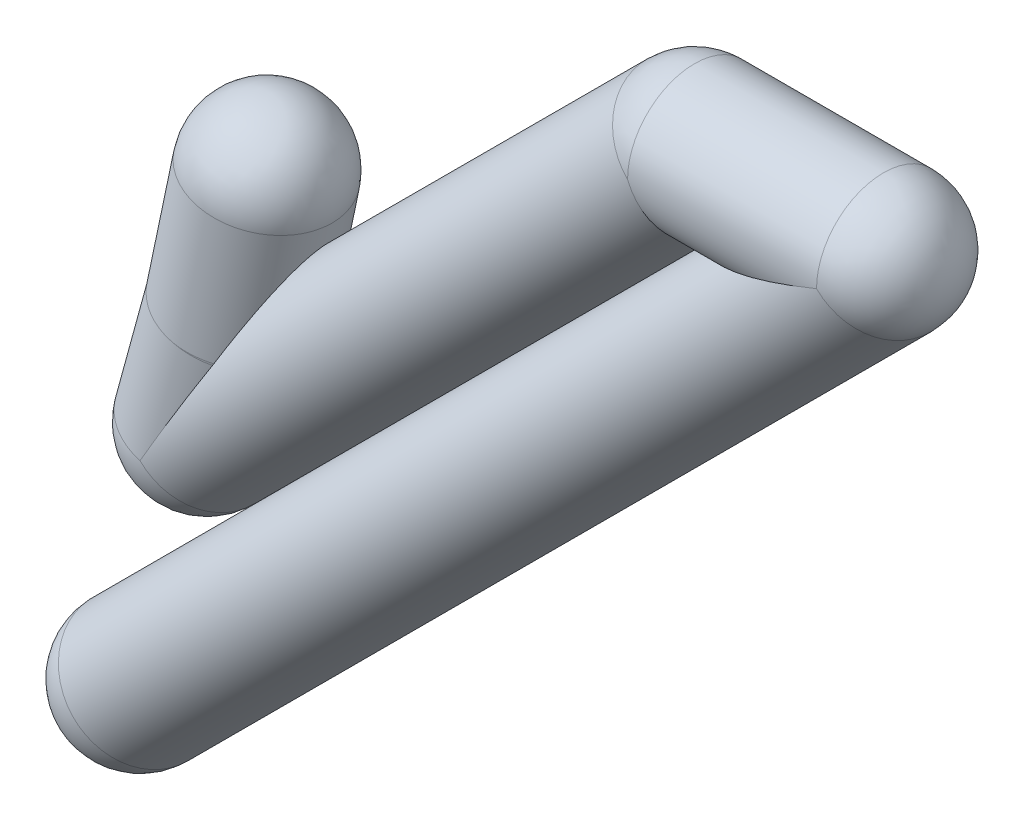
ISO-10303-21;
HEADER;
FILE_DESCRIPTION(('STEP AP214'),'2;1');
FILE_NAME('part.step','',(''),(''),'','','');
FILE_SCHEMA(('AUTOMOTIVE_DESIGN { 1 0 10303 214 1 1 1 1 }'));
ENDSEC;
DATA;
#1=APPLICATION_CONTEXT('core data for automotive mechanical design processes');
#2=APPLICATION_PROTOCOL_DEFINITION('international standard','automotive_design',2000,#1);
#3=PRODUCT_CONTEXT('',#1,'mechanical');
#4=PRODUCT('Part','Part','',(#3));
#5=PRODUCT_RELATED_PRODUCT_CATEGORY('part','',(#4));
#6=PRODUCT_DEFINITION_FORMATION('','',#4);
#7=PRODUCT_DEFINITION_CONTEXT('part definition',#1,'design');
#8=PRODUCT_DEFINITION('design','',#6,#7);
#9=PRODUCT_DEFINITION_SHAPE('','',#8);
#10=(LENGTH_UNIT() NAMED_UNIT(*) SI_UNIT(.MILLI.,.METRE.));
#11=(NAMED_UNIT(*) PLANE_ANGLE_UNIT() SI_UNIT($,.RADIAN.));
#12=(NAMED_UNIT(*) SI_UNIT($,.STERADIAN.) SOLID_ANGLE_UNIT());
#13=UNCERTAINTY_MEASURE_WITH_UNIT(LENGTH_MEASURE(1.E-05),#10,'distance_accuracy_value','');
#14=(GEOMETRIC_REPRESENTATION_CONTEXT(3) GLOBAL_UNCERTAINTY_ASSIGNED_CONTEXT((#13)) GLOBAL_UNIT_ASSIGNED_CONTEXT((#10,
#11,#12)) REPRESENTATION_CONTEXT('',''));
#15=CARTESIAN_POINT('',(0.,0.,0.));
#16=DIRECTION('',(0.,0.,1.));
#17=DIRECTION('',(1.,0.,0.));
#18=AXIS2_PLACEMENT_3D('',#15,#16,#17);
#19=CARTESIAN_POINT('',(12.435,-1.174,2.325));
#20=DIRECTION('',(1.,0.,0.));
#21=DIRECTION('',(0.,-1.,0.));
#22=AXIS2_PLACEMENT_3D('',#19,#20,#21);
#23=SPHERICAL_SURFACE('',#22,0.24);
#24=CARTESIAN_POINT('',(12.435,-1.174,2.325));
#25=DIRECTION('',(-0.707106781186548,-0.707106781186547,0.));
#26=DIRECTION('',(0.707106781186547,-0.707106781186548,0.));
#27=AXIS2_PLACEMENT_3D('',#24,#25,#26);
#28=SPHERICAL_SURFACE('',#27,0.24);
#29=CARTESIAN_POINT('',(12.435,-1.174,2.325));
#30=DIRECTION('',(-0.707106781186548,-0.707106781186547,0.));
#31=DIRECTION('',(0.707106781186547,-0.707106781186548,0.));
#32=AXIS2_PLACEMENT_3D('',#29,#30,#31);
#33=CIRCLE('',#32,0.24);
#34=CARTESIAN_POINT('',(12.6047056274848,-1.34370562748477,2.325));
#35=VERTEX_POINT('',#34);
#36=EDGE_CURVE('E241',#35,#35,#33,.F.);
#37=ORIENTED_EDGE('',*,*,#36,.F.);
#38=EDGE_LOOP('',(#37));
#39=FACE_BOUND('',#38,.T.);
#40=ADVANCED_FACE('F63',(#39),#28,.T.);
#41=CARTESIAN_POINT('',(15.101,1.492,2.325));
#42=DIRECTION('',(-0.707106781186548,-0.707106781186547,0.));
#43=DIRECTION('',(0.707106781186547,-0.707106781186548,0.));
#44=AXIS2_PLACEMENT_3D('',#41,#42,#43);
#45=CYLINDRICAL_SURFACE('',#44,0.24);
#46=CARTESIAN_POINT('',(15.101,1.492,2.325));
#47=DIRECTION('',(0.38268343236509,-0.923879532511287,0.));
#48=DIRECTION('',(-0.923879532511287,-0.38268343236509,0.));
#49=AXIS2_PLACEMENT_3D('',#46,#47,#48);
#50=ELLIPSE('',#49,0.627150223140661,0.24);
#51=CARTESIAN_POINT('',(15.101,1.492,2.085));
#52=VERTEX_POINT('',#51);
#53=CARTESIAN_POINT('',(14.5222565276299,1.2522766046094,2.31348072466869));
#54=VERTEX_POINT('',#53);
#55=EDGE_CURVE('E12',#52,#54,#50,.F.);
#56=ORIENTED_EDGE('',*,*,#55,.F.);
#57=CARTESIAN_POINT('',(15.101,1.492,2.325));
#58=DIRECTION('',(-0.707106781186548,-0.707106781186547,0.));
#59=DIRECTION('',(0.707106781186547,-0.707106781186548,0.));
#60=AXIS2_PLACEMENT_3D('',#57,#58,#59);
#61=CIRCLE('',#60,0.24);
#62=CARTESIAN_POINT('',(15.101,1.492,2.565));
#63=VERTEX_POINT('',#62);
#64=EDGE_CURVE('E83',#52,#63,#61,.T.);
#65=ORIENTED_EDGE('',*,*,#64,.T.);
#66=CARTESIAN_POINT('',(14.5222565276299,1.2522766046094,2.3365192756046));
#67=VERTEX_POINT('',#66);
#68=EDGE_CURVE('E66',#67,#63,#50,.F.);
#69=ORIENTED_EDGE('',*,*,#68,.F.);
#70=CARTESIAN_POINT('',(14.9315484770248,1.66145152297523,2.31187130155912));
#71=CARTESIAN_POINT('',(14.8183932611086,1.54832866391458,2.31220720513702));
#72=CARTESIAN_POINT('',(14.7052411960202,1.43520895318279,2.3126706603257));
#73=CARTESIAN_POINT('',(14.3657767120083,1.09584153169066,2.31423044289002));
#74=CARTESIAN_POINT('',(14.1394668168106,0.869596341014294,2.31549615916292));
#75=CARTESIAN_POINT('',(13.6868372918324,0.417096230071525,2.31734150102584));
#76=CARTESIAN_POINT('',(13.4605176647894,0.190841312541712,2.31792118873812));
#77=CARTESIAN_POINT('',(13.2201221281214,-0.0494854905740796,2.32247921939916));
#78=CARTESIAN_POINT('',(13.2059808662314,-0.0636227092164164,2.32276184463907));
#79=CARTESIAN_POINT('',(13.184762909386,-0.0848345994555943,2.32324907258476));
#80=CARTESIAN_POINT('',(13.1776892321352,-0.0919062542110759,2.32342203066108));
#81=CARTESIAN_POINT('',(13.1670915424444,-0.102500913826222,2.32389016131879));
#82=CARTESIAN_POINT('',(13.1635610878239,-0.106030359024401,2.32408098956499));
#83=CARTESIAN_POINT('',(13.1582518429061,-0.111338085930861,2.3243235117166));
#84=CARTESIAN_POINT('',(13.1564796174392,-0.113109804685761,2.32439707202605));
#85=CARTESIAN_POINT('',(13.1546193698713,-0.114969520374432,2.32477761588291));
#86=CARTESIAN_POINT('',(13.1545100209914,-0.115078837989458,2.32480111392552));
#87=CARTESIAN_POINT('',(13.1543474957414,-0.115241316770415,2.3248477223718));
#88=CARTESIAN_POINT('',(13.1542935589342,-0.115295238156102,2.3248651570408));
#89=CARTESIAN_POINT('',(13.1542140686741,-0.115374705688486,2.32489953465524));
#90=CARTESIAN_POINT('',(13.1541877927299,-0.115400974119897,2.32491237475772));
#91=CARTESIAN_POINT('',(13.1541565863955,-0.115432171531798,2.32493366726682));
#92=CARTESIAN_POINT('',(13.1541503964615,-0.115438359695989,2.324938213098));
#93=CARTESIAN_POINT('',(13.1541384847982,-0.115450267953515,2.32494844025701));
#94=CARTESIAN_POINT('',(13.1541327621989,-0.115455988916624,2.32495411940378));
#95=CARTESIAN_POINT('',(13.1541252858451,-0.115463463132872,2.3249632837121));
#96=CARTESIAN_POINT('',(13.1541231497533,-0.115465598613896,2.32496613997214));
#97=CARTESIAN_POINT('',(13.1541192192782,-0.115469527965226,2.32497228743375));
#98=CARTESIAN_POINT('',(13.1541174229896,-0.115471323740196,2.32497557602374));
#99=CARTESIAN_POINT('',(13.1541151044775,-0.115473641589398,2.32498100970236));
#100=CARTESIAN_POINT('',(13.1541143774664,-0.115474368392618,2.32498297908466));
#101=CARTESIAN_POINT('',(13.1541131374502,-0.115475608054314,2.3249870522834));
#102=CARTESIAN_POINT('',(13.1541126244257,-0.115476120932051,2.32498915608772));
#103=CARTESIAN_POINT('',(13.1541118674313,-0.115476877710008,2.32499348222955));
#104=CARTESIAN_POINT('',(13.1541116261713,-0.115477118901041,2.32499570553327));
#105=CARTESIAN_POINT('',(13.154111436926,-0.1154773080923,2.32500017607585));
#106=CARTESIAN_POINT('',(13.1541114885538,-0.115477256479202,2.32500242327925));
#107=CARTESIAN_POINT('',(13.1541118814331,-0.115476863712223,2.32500659189253));
#108=CARTESIAN_POINT('',(13.1541121873597,-0.115476557873164,2.32500852015973));
#109=CARTESIAN_POINT('',(13.1541129985368,-0.115475746927985,2.32501228999817));
#110=CARTESIAN_POINT('',(13.1541135040165,-0.11547524159274,2.32501413146697));
#111=CARTESIAN_POINT('',(13.154115031386,-0.115473714659948,2.32501878853099));
#112=CARTESIAN_POINT('',(13.1541161807377,-0.115472565636866,2.32502152013781));
#113=CARTESIAN_POINT('',(13.1541187546094,-0.115469992501126,2.32502670698718));
#114=CARTESIAN_POINT('',(13.1541201799138,-0.115468567604275,2.32502916140956));
#115=CARTESIAN_POINT('',(13.1541254557076,-0.115463293318937,2.32503735458608));
#116=CARTESIAN_POINT('',(13.1541297476163,-0.115459002637321,2.32504252072062));
#117=CARTESIAN_POINT('',(13.1541388421827,-0.115449910671196,2.32505185463014));
#118=CARTESIAN_POINT('',(13.1541436482334,-0.11544510599469,2.32505601509682));
#119=CARTESIAN_POINT('',(13.1541670381589,-0.115421722756775,2.32507493016181));
#120=CARTESIAN_POINT('',(13.1541867248462,-0.115402041698251,2.32508692801745));
#121=CARTESIAN_POINT('',(13.154226966804,-0.115361811246432,2.32510720698871));
#122=CARTESIAN_POINT('',(13.1542475243217,-0.115341259606482,2.32511547775488));
#123=CARTESIAN_POINT('',(13.1544311505347,-0.11515768589562,2.32518528220285));
#124=CARTESIAN_POINT('',(13.1545986250781,-0.114990259236263,2.32522048213879));
#125=CARTESIAN_POINT('',(13.1554347573212,-0.114154366058874,2.32537806822431));
#126=CARTESIAN_POINT('',(13.1561058658958,-0.113483449366662,2.32544673426334));
#127=CARTESIAN_POINT('',(13.1594610881164,-0.110129186466165,2.32575601915949));
#128=CARTESIAN_POINT('',(13.1621504659354,-0.107440577590043,2.32589524443473));
#129=CARTESIAN_POINT('',(13.1755954750622,-0.0939994126401843,2.32652069529827));
#130=CARTESIAN_POINT('',(13.1863516111583,-0.0832463519224445,2.32679526620413));
#131=CARTESIAN_POINT('',(13.240133071824,-0.0294802683717343,2.32803224668867));
#132=CARTESIAN_POINT('',(13.2831668302808,0.0135411859371182,2.32858721534035));
#133=CARTESIAN_POINT('',(13.4983318809932,0.228644716979404,2.33108329948833));
#134=CARTESIAN_POINT('',(13.6704580248829,0.400721646819277,2.33218822913255));
#135=CARTESIAN_POINT('',(14.2055428254038,0.935653456691512,2.33524858082368));
#136=CARTESIAN_POINT('',(14.5685084541125,1.2985153068053,2.33678884016517));
#137=CARTESIAN_POINT('',(14.9314965255411,1.66139959323126,2.33812841784612));
#138=CARTESIAN_POINT('',(14.9315224996435,1.66142555990721,2.33812851370039));
#139=CARTESIAN_POINT('',(14.9315484737459,1.66145152658314,2.33812860955362));
#140=B_SPLINE_CURVE_WITH_KNOTS('',3,(#70,#71,#72,#73,#74,#75,#76,#77,#78,#79,#80,#81,#82,#83,
#84,#85,#86,#87,#88,#89,#90,#91,#92,#93,#94,#95,#96,#97,#98,#99,#100,#101,#102,#103,#104,#105,
#106,#107,#108,#109,#110,#111,#112,#113,#114,#115,#116,#117,#118,#119,#120,#121,#122,#123,#124,
#125,#126,#127,#128,#129,#130,#131,#132,#133,#134,#135,#136,#137,#138,#139),.UNSPECIFIED.,.F.,
.F.,(4,2,2,2,2,2,2,2,2,2,2,2,2,2,2,2,2,2,2,2,2,2,2,2,2,2,2,2,2,2,2,2,2,2,4),(0.,
0.480000004613868,1.44004588018274,2.40000481362612,2.46000497104678,2.49000517100575,
2.50500551861605,2.5125075199603,2.51297642325675,2.51321097549291,2.51332838961192,
2.51335794246257,2.5133874389781,2.51339988844516,2.5134122658955,2.51341891144288,
2.51342555639178,2.51343226703147,2.51343896881119,2.51344487022441,2.51345077843532,
2.5134602578663,2.51346976464972,2.51349347703732,2.51351735688727,2.51360772670889,
2.51369834594794,2.51441435207518,2.51726956603105,2.52868158450876,2.57432096684122,
2.75686987721037,3.48705692685646,5.02675980177134,5.02686998517754),.UNSPECIFIED.);
#141=EDGE_CURVE('E77',#54,#67,#140,.T.);
#142=ORIENTED_EDGE('',*,*,#141,.F.);
#143=EDGE_LOOP('',(#56,#65,#69,#142));
#144=FACE_BOUND('',#143,.T.);
#145=ORIENTED_EDGE('',*,*,#36,.T.);
#146=EDGE_LOOP('',(#145));
#147=FACE_BOUND('',#146,.T.);
#148=ADVANCED_FACE('F246',(#144,#147),#45,.T.);
#149=CARTESIAN_POINT('',(15.101,1.492,2.325));
#150=DIRECTION('',(1.,0.,0.));
#151=DIRECTION('',(0.,-1.,0.));
#152=AXIS2_PLACEMENT_3D('',#149,#150,#151);
#153=SPHERICAL_SURFACE('',#152,0.24);
#154=ORIENTED_EDGE('',*,*,#64,.F.);
#155=CARTESIAN_POINT('',(15.101,1.492,2.325));
#156=DIRECTION('',(1.,0.,0.));
#157=DIRECTION('',(0.,0.,-1.));
#158=AXIS2_PLACEMENT_3D('',#155,#156,#157);
#159=CIRCLE('',#158,0.24);
#160=EDGE_CURVE('E228',#63,#52,#159,.F.);
#161=ORIENTED_EDGE('',*,*,#160,.F.);
#162=EDGE_LOOP('',(#154,#161));
#163=FACE_BOUND('',#162,.T.);
#164=ADVANCED_FACE('F250',(#163),#153,.T.);
#165=CARTESIAN_POINT('',(14.423,1.492,2.325));
#166=DIRECTION('',(1.,0.,0.));
#167=DIRECTION('',(0.,0.,-1.));
#168=AXIS2_PLACEMENT_3D('',#165,#166,#167);
#169=CYLINDRICAL_SURFACE('',#168,0.24);
#170=ORIENTED_EDGE('',*,*,#160,.T.);
#171=ORIENTED_EDGE('',*,*,#55,.T.);
#172=CARTESIAN_POINT('',(14.423,1.492,2.325));
#173=DIRECTION('',(0.923934239027247,0.38255133244199,0.));
#174=DIRECTION('',(0.38255133244199,-0.923934239027247,0.));
#175=AXIS2_PLACEMENT_3D('',#172,#173,#174);
#176=ELLIPSE('',#175,0.259758746740116,0.24);
#177=CARTESIAN_POINT('',(14.423,1.492,2.085));
#178=VERTEX_POINT('',#177);
#179=EDGE_CURVE('E237',#178,#54,#176,.F.);
#180=ORIENTED_EDGE('',*,*,#179,.F.);
#181=CARTESIAN_POINT('',(14.423,1.492,2.325));
#182=DIRECTION('',(1.,0.,0.));
#183=DIRECTION('',(0.,0.,-1.));
#184=AXIS2_PLACEMENT_3D('',#181,#182,#183);
#185=CIRCLE('',#184,0.24);
#186=CARTESIAN_POINT('',(14.423,1.492,2.565));
#187=VERTEX_POINT('',#186);
#188=EDGE_CURVE('E226',#178,#187,#185,.T.);
#189=ORIENTED_EDGE('',*,*,#188,.T.);
#190=EDGE_CURVE('E234',#67,#187,#176,.F.);
#191=ORIENTED_EDGE('',*,*,#190,.F.);
#192=ORIENTED_EDGE('',*,*,#68,.T.);
#193=EDGE_LOOP('',(#170,#171,#180,#189,#191,#192));
#194=FACE_BOUND('',#193,.T.);
#195=ADVANCED_FACE('F252',(#194),#169,.T.);
#196=CARTESIAN_POINT('',(14.423,1.492,2.325));
#197=DIRECTION('',(1.,0.,0.));
#198=DIRECTION('',(0.,-1.,0.));
#199=AXIS2_PLACEMENT_3D('',#196,#197,#198);
#200=SPHERICAL_SURFACE('',#199,0.24);
#201=ORIENTED_EDGE('',*,*,#188,.F.);
#202=CARTESIAN_POINT('',(14.423,1.492,2.325));
#203=DIRECTION('',(0.707308956093716,0.706904548457299,0.));
#204=DIRECTION('',(-0.706904548457299,0.707308956093716,0.));
#205=AXIS2_PLACEMENT_3D('',#202,#203,#204);
#206=CIRCLE('',#205,0.24);
#207=EDGE_CURVE('E219',#187,#178,#206,.F.);
#208=ORIENTED_EDGE('',*,*,#207,.F.);
#209=EDGE_LOOP('',(#201,#208));
#210=FACE_BOUND('',#209,.T.);
#211=ADVANCED_FACE('F177',(#210),#200,.T.);
#212=CARTESIAN_POINT('',(12.674,-0.256000000000002,2.325));
#213=DIRECTION('',(0.707308956093716,0.706904548457299,0.));
#214=DIRECTION('',(-0.706904548457299,0.707308956093716,0.));
#215=AXIS2_PLACEMENT_3D('',#212,#213,#214);
#216=CYLINDRICAL_SURFACE('',#215,0.24);
#217=CARTESIAN_POINT('',(12.674,-0.256000000000005,2.325));
#218=DIRECTION('',(0.864938033784384,-0.501878668318552,0.));
#219=DIRECTION('',(0.501878668318552,0.864938033784384,0.));
#220=AXIS2_PLACEMENT_3D('',#217,#218,#219);
#221=ELLIPSE('',#220,0.933859028273947,0.24);
#222=CARTESIAN_POINT('',(12.674,-0.255999999999986,2.565));
#223=VERTEX_POINT('',#222);
#224=CARTESIAN_POINT('',(12.9032862619346,0.139152097689159,2.53431944434261));
#225=VERTEX_POINT('',#224);
#226=EDGE_CURVE('E223',#223,#225,#221,.F.);
#227=ORIENTED_EDGE('',*,*,#226,.F.);
#228=CARTESIAN_POINT('',(12.674,-0.256000000000002,2.325));
#229=DIRECTION('',(0.707308956093716,0.706904548457299,0.));
#230=DIRECTION('',(-0.706904548457299,0.707308956093716,0.));
#231=AXIS2_PLACEMENT_3D('',#228,#229,#230);
#232=CIRCLE('',#231,0.24);
#233=CARTESIAN_POINT('',(12.674,-0.255999999999986,2.085));
#234=VERTEX_POINT('',#233);
#235=EDGE_CURVE('E149',#223,#234,#232,.T.);
#236=ORIENTED_EDGE('',*,*,#235,.T.);
#237=CARTESIAN_POINT('',(12.9032862619387,0.139152097687392,2.11568055565501));
#238=VERTEX_POINT('',#237);
#239=EDGE_CURVE('E194',#238,#234,#221,.F.);
#240=ORIENTED_EDGE('',*,*,#239,.F.);
#241=CARTESIAN_POINT('',(12.9349190353031,0.222863993235056,2.14114170830209));
#242=CARTESIAN_POINT('',(12.9324361136405,0.211607901367766,2.13593318031268));
#243=CARTESIAN_POINT('',(12.9293237458869,0.200114223258226,2.13149622416911));
#244=CARTESIAN_POINT('',(12.9217000335232,0.177463029894236,2.12412549624312));
#245=CARTESIAN_POINT('',(12.9172257373689,0.166304313955249,2.12115681183345));
#246=CARTESIAN_POINT('',(12.9077882261218,0.146888805776847,2.11694916804711));
#247=CARTESIAN_POINT('',(12.9031433219007,0.138528969822518,2.1154743752733));
#248=CARTESIAN_POINT('',(12.8927262324233,0.122206614657194,2.11319732217792));
#249=CARTESIAN_POINT('',(12.8869333680192,0.11425537910161,2.11240909580979));
#250=CARTESIAN_POINT('',(12.8805973440214,0.10671881936907,2.11195631097302));
#251=B_SPLINE_CURVE_WITH_KNOTS('',3,(#241,#242,#243,#244,#245,#246,#247,#248,#249,#250),
.UNSPECIFIED.,.F.,.F.,(4,2,2,2,4),(0.,0.0379384179385173,0.0749252325999626,0.103862725600159,
0.133378706870928),.UNSPECIFIED.);
#252=CARTESIAN_POINT('',(12.9068094119,0.145434930544626,2.1167882840611));
#253=VERTEX_POINT('',#252);
#254=EDGE_CURVE('E125',#253,#238,#251,.T.);
#255=ORIENTED_EDGE('',*,*,#254,.F.);
#256=CARTESIAN_POINT('',(12.7074405604834,-0.222578559333886,2.325));
#257=DIRECTION('',(0.879263737439075,-0.476335260110639,0.));
#258=DIRECTION('',(0.476335260110639,0.879263737439074,0.));
#259=AXIS2_PLACEMENT_3D('',#256,#257,#258);
#260=ELLIPSE('',#259,0.841551450561047,0.24);
#261=CARTESIAN_POINT('',(12.9068094119,0.145434930544626,2.5332117159389));
#262=VERTEX_POINT('',#261);
#263=EDGE_CURVE('E140',#262,#253,#260,.F.);
#264=ORIENTED_EDGE('',*,*,#263,.F.);
#265=CARTESIAN_POINT('',(12.8805973440214,0.106718819369069,2.53804368902698));
#266=CARTESIAN_POINT('',(12.8887402513053,0.116378429240676,2.53746083611555));
#267=CARTESIAN_POINT('',(12.895963420877,0.126727081040045,2.53632915539967));
#268=CARTESIAN_POINT('',(12.9085131448779,0.14799964207933,2.53289612816313));
#269=CARTESIAN_POINT('',(12.9138817183168,0.158903324479266,2.5306240285567));
#270=CARTESIAN_POINT('',(12.9220751037553,0.178651573406285,2.52543851012246));
#271=CARTESIAN_POINT('',(12.9251982088224,0.187439651305042,2.52276501848935));
#272=CARTESIAN_POINT('',(12.9306552090814,0.205152157060745,2.51651512914655));
#273=CARTESIAN_POINT('',(12.9329723474482,0.214075861057589,2.512921984064));
#274=CARTESIAN_POINT('',(12.9349190353031,0.222863993235056,2.50885829169791));
#275=B_SPLINE_CURVE_WITH_KNOTS('',3,(#265,#266,#267,#268,#269,#270,#271,#272,#273,#274),
.UNSPECIFIED.,.F.,.F.,(4,2,2,2,4),(0.,0.0378256277319844,0.0747272814984642,0.103763304733729,
0.133371253112802),.UNSPECIFIED.);
#276=EDGE_CURVE('E183',#225,#262,#275,.T.);
#277=ORIENTED_EDGE('',*,*,#276,.F.);
#278=EDGE_LOOP('',(#227,#236,#240,#255,#264,#277));
#279=FACE_BOUND('',#278,.T.);
#280=ORIENTED_EDGE('',*,*,#179,.T.);
#281=ORIENTED_EDGE('',*,*,#141,.T.);
#282=ORIENTED_EDGE('',*,*,#190,.T.);
#283=ORIENTED_EDGE('',*,*,#207,.T.);
#284=EDGE_LOOP('',(#280,#281,#282,#283));
#285=FACE_BOUND('',#284,.T.);
#286=ADVANCED_FACE('F172',(#279,#285),#216,.T.);
#287=CARTESIAN_POINT('',(12.674,-0.256,2.325));
#288=DIRECTION('',(1.,0.,0.));
#289=DIRECTION('',(0.,-1.,0.));
#290=AXIS2_PLACEMENT_3D('',#287,#288,#289);
#291=SPHERICAL_SURFACE('',#290,0.24);
#292=ORIENTED_EDGE('',*,*,#235,.F.);
#293=CARTESIAN_POINT('',(12.674,-0.256,2.325));
#294=DIRECTION('',(-0.262734085961696,-0.964868281204161,0.));
#295=DIRECTION('',(0.964868281204161,-0.262734085961696,0.));
#296=AXIS2_PLACEMENT_3D('',#293,#294,#295);
#297=CIRCLE('',#296,0.24);
#298=EDGE_CURVE('E129',#234,#223,#297,.F.);
#299=ORIENTED_EDGE('',*,*,#298,.F.);
#300=EDGE_LOOP('',(#292,#299));
#301=FACE_BOUND('',#300,.T.);
#302=ADVANCED_FACE('F169',(#301),#291,.T.);
#303=CARTESIAN_POINT('',(12.79,0.17,2.325));
#304=DIRECTION('',(1.,0.,0.));
#305=DIRECTION('',(0.,-1.,0.));
#306=AXIS2_PLACEMENT_3D('',#303,#304,#305);
#307=SPHERICAL_SURFACE('',#306,0.24);
#308=CARTESIAN_POINT('',(12.79,0.17,2.325));
#309=DIRECTION('',(-0.205798806370386,-0.978594324169379,0.));
#310=DIRECTION('',(0.978594324169379,-0.205798806370386,0.));
#311=AXIS2_PLACEMENT_3D('',#308,#309,#310);
#312=CIRCLE('',#311,0.24);
#313=CARTESIAN_POINT('',(12.79,0.170000000000003,2.085));
#314=VERTEX_POINT('',#313);
#315=EDGE_CURVE('E124',#314,#253,#312,.T.);
#316=ORIENTED_EDGE('',*,*,#315,.T.);
#317=ORIENTED_EDGE('',*,*,#254,.T.);
#318=CARTESIAN_POINT('',(12.79,0.170000000000002,2.325));
#319=DIRECTION('',(-0.262734085961714,-0.964868281204156,0.));
#320=DIRECTION('',(0.964868281204156,-0.262734085961714,0.));
#321=AXIS2_PLACEMENT_3D('',#318,#319,#320);
#322=CIRCLE('',#321,0.24);
#323=EDGE_CURVE('E121',#314,#238,#322,.T.);
#324=ORIENTED_EDGE('',*,*,#323,.F.);
#325=EDGE_LOOP('',(#316,#317,#324));
#326=FACE_BOUND('',#325,.T.);
#327=ADVANCED_FACE('F123',(#326),#307,.T.);
#328=CARTESIAN_POINT('',(12.79,0.170000000000002,2.325));
#329=DIRECTION('',(-0.262734085961696,-0.964868281204161,0.));
#330=DIRECTION('',(0.964868281204161,-0.262734085961696,0.));
#331=AXIS2_PLACEMENT_3D('',#328,#329,#330);
#332=CYLINDRICAL_SURFACE('',#331,0.24);
#333=ORIENTED_EDGE('',*,*,#298,.T.);
#334=ORIENTED_EDGE('',*,*,#226,.T.);
#335=CARTESIAN_POINT('',(12.79,0.170000000000005,2.565));
#336=VERTEX_POINT('',#335);
#337=EDGE_CURVE('E130',#225,#336,#322,.T.);
#338=ORIENTED_EDGE('',*,*,#337,.T.);
#339=CARTESIAN_POINT('',(12.79,0.17000000000005,2.565));
#340=CARTESIAN_POINT('',(12.7861807921311,0.170920740495385,2.56500008343138));
#341=CARTESIAN_POINT('',(12.7823620116968,0.171843225975598,2.5649036226738));
#342=CARTESIAN_POINT('',(12.7747345202072,0.173689181172995,2.56451820130866));
#343=CARTESIAN_POINT('',(12.7709258088929,0.174612650863999,2.56422924569961));
#344=CARTESIAN_POINT('',(12.7633275663386,0.176458093635804,2.56345943277572));
#345=CARTESIAN_POINT('',(12.7595380346191,0.177380066753629,2.56297858028348));
#346=CARTESIAN_POINT('',(12.7519872124855,0.179220048997767,2.56182615849777));
#347=CARTESIAN_POINT('',(12.7482259213876,0.180138058219832,2.56115459383771));
#348=CARTESIAN_POINT('',(12.7407405774318,0.18196766280007,2.55962235872657));
#349=CARTESIAN_POINT('',(12.7370165237025,0.182879258308186,2.55876169271166));
#350=CARTESIAN_POINT('',(12.7296145635722,0.184693609508368,2.55685333040547));
#351=CARTESIAN_POINT('',(12.7259366561293,0.185596365399925,2.55580563834526));
#352=CARTESIAN_POINT('',(12.7186357888545,0.187390641042855,2.55352574763805));
#353=CARTESIAN_POINT('',(12.7150128278273,0.188282161038559,2.55229355301068));
#354=CARTESIAN_POINT('',(12.707830523525,0.190051604003146,2.54964762598854));
#355=CARTESIAN_POINT('',(12.704271178919,0.190929527256444,2.54823389739682));
#356=CARTESIAN_POINT('',(12.6972246266081,0.192669456964789,2.5452283084289));
#357=CARTESIAN_POINT('',(12.6937374174542,0.193531463739555,2.54363645163535));
#358=CARTESIAN_POINT('',(12.6868434836718,0.195237287425704,2.54027844142214));
#359=CARTESIAN_POINT('',(12.6834367574936,0.196081104687324,2.53851229136213));
#360=CARTESIAN_POINT('',(12.6767119456548,0.197748328463564,2.53480994965149));
#361=CARTESIAN_POINT('',(12.6733938583614,0.198571735354168,2.53287376113615));
#362=CARTESIAN_POINT('',(12.6668542690035,0.200195975036683,2.52883600719161));
#363=CARTESIAN_POINT('',(12.6636327652404,0.200996808225587,2.52673444467325));
#364=CARTESIAN_POINT('',(12.6572940572342,0.202573799896474,2.52237100579826));
#365=CARTESIAN_POINT('',(12.6541768512439,0.203349958791783,2.5201091321291));
#366=CARTESIAN_POINT('',(12.6480542040707,0.204875569071171,2.51543052022994));
#367=CARTESIAN_POINT('',(12.6450487611089,0.205625020880309,2.51301378446637));
#368=CARTESIAN_POINT('',(12.6391568382914,0.207095256884042,2.50803127072894));
#369=CARTESIAN_POINT('',(12.6362703566419,0.207816041510923,2.50546549500395));
#370=CARTESIAN_POINT('',(12.6306232704191,0.209227060469767,2.50019108274025));
#371=CARTESIAN_POINT('',(12.6278626640529,0.209917295236848,2.49748244823747));
#372=CARTESIAN_POINT('',(12.6224739413816,0.211265413754054,2.49192884396862));
#373=CARTESIAN_POINT('',(12.6198458233003,0.211923297937874,2.48908387603126));
#374=CARTESIAN_POINT('',(12.6147283732683,0.213205000862809,2.48326445887638));
#375=CARTESIAN_POINT('',(12.6122390395731,0.213828820032089,2.48029001128714));
#376=CARTESIAN_POINT('',(12.6074051222996,0.215040768928537,2.47421880073187));
#377=CARTESIAN_POINT('',(12.605060537023,0.215628899074404,2.47112203920152));
#378=CARTESIAN_POINT('',(12.6005217341229,0.216767940263155,2.46481366132387));
#379=CARTESIAN_POINT('',(12.5983275148612,0.217318851711519,2.46160204622842));
#380=CARTESIAN_POINT('',(12.5940947015444,0.218382023867858,2.45507169846323));
#381=CARTESIAN_POINT('',(12.5920561059241,0.218894284964538,2.45175296687123));
#382=CARTESIAN_POINT('',(12.5881394247956,0.219878826252333,2.44501638139827));
#383=CARTESIAN_POINT('',(12.5862613378075,0.22035110681204,2.44159852843151));
#384=CARTESIAN_POINT('',(12.5826701744334,0.22125446153725,2.43467193427523));
#385=CARTESIAN_POINT('',(12.5809570966642,0.221685536048122,2.43116319384778));
#386=CARTESIAN_POINT('',(12.5777000569608,0.222505360815686,2.42406327778019));
#387=CARTESIAN_POINT('',(12.5761560937507,0.222894111391654,2.42047210276215));
#388=CARTESIAN_POINT('',(12.5732409832522,0.223628280750936,2.41321596910295));
#389=CARTESIAN_POINT('',(12.571869834805,0.223973699824816,2.40955101095674));
#390=CARTESIAN_POINT('',(12.5693036398593,0.224620311390001,2.40215614036746));
#391=CARTESIAN_POINT('',(12.5681085923277,0.224921504140809,2.39842622830567));
#392=CARTESIAN_POINT('',(12.5658974632658,0.225478883173919,2.39091043567729));
#393=CARTESIAN_POINT('',(12.5648813808354,0.225735069682578,2.3871245553923));
#394=CARTESIAN_POINT('',(12.5630306171543,0.226201773128059,2.37950594692756));
#395=CARTESIAN_POINT('',(12.5621959351433,0.226412290256294,2.37567321894424));
#396=CARTESIAN_POINT('',(12.5607099727394,0.226787110217464,2.36797014853824));
#397=CARTESIAN_POINT('',(12.5600586917317,0.22695141320536,2.36409980624174));
#398=CARTESIAN_POINT('',(12.5589410922144,0.227233379854343,2.35633083126581));
#399=CARTESIAN_POINT('',(12.5584747732397,0.227351043632721,2.35243219865755));
#400=CARTESIAN_POINT('',(12.5577282153509,0.227539427546841,2.34461603525288));
#401=CARTESIAN_POINT('',(12.5574479761247,0.227610147761287,2.34069850448816));
#402=CARTESIAN_POINT('',(12.5570742492854,0.227704461680313,2.33285398247701));
#403=CARTESIAN_POINT('',(12.5569807615158,0.227728055424398,2.32892699123851));
#404=CARTESIAN_POINT('',(12.5569807615158,0.227728055424398,2.32107300876149));
#405=CARTESIAN_POINT('',(12.5570742492854,0.227704461680313,2.31714601752299));
#406=CARTESIAN_POINT('',(12.5574479761247,0.227610147761287,2.30930149551184));
#407=CARTESIAN_POINT('',(12.5577282153509,0.227539427546841,2.30538396474712));
#408=CARTESIAN_POINT('',(12.5584747732397,0.227351043632721,2.29756780134245));
#409=CARTESIAN_POINT('',(12.5589410922144,0.227233379854343,2.29366916873419));
#410=CARTESIAN_POINT('',(12.5600586917317,0.22695141320536,2.28590019375826));
#411=CARTESIAN_POINT('',(12.5607099727394,0.226787110217464,2.28202985146176));
#412=CARTESIAN_POINT('',(12.5621959351433,0.226412290256294,2.27432678105576));
#413=CARTESIAN_POINT('',(12.5630306171543,0.226201773128059,2.27049405307244));
#414=CARTESIAN_POINT('',(12.5648813808354,0.225735069682578,2.2628754446077));
#415=CARTESIAN_POINT('',(12.5658974632658,0.225478883173919,2.25908956432271));
#416=CARTESIAN_POINT('',(12.5681085923277,0.224921504140809,2.25157377169433));
#417=CARTESIAN_POINT('',(12.5693036398593,0.224620311390001,2.24784385963254));
#418=CARTESIAN_POINT('',(12.571869834805,0.223973699824816,2.24044898904326));
#419=CARTESIAN_POINT('',(12.5732409832522,0.223628280750936,2.23678403089705));
#420=CARTESIAN_POINT('',(12.5761560937507,0.222894111391654,2.22952789723785));
#421=CARTESIAN_POINT('',(12.5777000569608,0.222505360815686,2.22593672221981));
#422=CARTESIAN_POINT('',(12.5809570966642,0.221685536048122,2.21883680615222));
#423=CARTESIAN_POINT('',(12.5826701744334,0.22125446153725,2.21532806572477));
#424=CARTESIAN_POINT('',(12.5862613378075,0.22035110681204,2.20840147156849));
#425=CARTESIAN_POINT('',(12.5881394247956,0.219878826252333,2.20498361860173));
#426=CARTESIAN_POINT('',(12.5920561059241,0.218894284964538,2.19824703312877));
#427=CARTESIAN_POINT('',(12.5940947015444,0.218382023867858,2.19492830153677));
#428=CARTESIAN_POINT('',(12.5983275148612,0.217318851711519,2.18839795377158));
#429=CARTESIAN_POINT('',(12.6005217341229,0.216767940263155,2.18518633867613));
#430=CARTESIAN_POINT('',(12.605060537023,0.215628899074404,2.17887796079848));
#431=CARTESIAN_POINT('',(12.6074051222996,0.215040768928537,2.17578119926813));
#432=CARTESIAN_POINT('',(12.6122390395731,0.213828820032089,2.16970998871286));
#433=CARTESIAN_POINT('',(12.6147283732683,0.213205000862809,2.16673554112362));
#434=CARTESIAN_POINT('',(12.6198458233003,0.211923297937874,2.16091612396874));
#435=CARTESIAN_POINT('',(12.6224739413816,0.211265413754054,2.15807115603138));
#436=CARTESIAN_POINT('',(12.6278626640529,0.209917295236848,2.15251755176253));
#437=CARTESIAN_POINT('',(12.6306232704191,0.209227060469767,2.14980891725975));
#438=CARTESIAN_POINT('',(12.6362703566419,0.207816041510923,2.14453450499605));
#439=CARTESIAN_POINT('',(12.6391568382914,0.207095256884042,2.14196872927106));
#440=CARTESIAN_POINT('',(12.6450487611089,0.205625020880309,2.13698621553363));
#441=CARTESIAN_POINT('',(12.6480542040707,0.204875569071171,2.13456947977006));
#442=CARTESIAN_POINT('',(12.6541768512439,0.203349958791783,2.1298908678709));
#443=CARTESIAN_POINT('',(12.6572940572342,0.202573799896474,2.12762899420174));
#444=CARTESIAN_POINT('',(12.6636327652404,0.200996808225587,2.12326555532675));
#445=CARTESIAN_POINT('',(12.6668542690035,0.200195975036683,2.12116399280839));
#446=CARTESIAN_POINT('',(12.6733938583614,0.198571735354168,2.11712623886385));
#447=CARTESIAN_POINT('',(12.6767119456548,0.197748328463564,2.11519005034851));
#448=CARTESIAN_POINT('',(12.6834367574936,0.196081104687324,2.11148770863787));
#449=CARTESIAN_POINT('',(12.6868434836718,0.195237287425704,2.10972155857786));
#450=CARTESIAN_POINT('',(12.6937374174542,0.193531463739555,2.10636354836465));
#451=CARTESIAN_POINT('',(12.6972246266081,0.192669456964789,2.1047716915711));
#452=CARTESIAN_POINT('',(12.704271178919,0.190929527256444,2.10176610260318));
#453=CARTESIAN_POINT('',(12.707830523525,0.190051604003146,2.10035237401147));
#454=CARTESIAN_POINT('',(12.7150128278273,0.18828216103856,2.09770644698932));
#455=CARTESIAN_POINT('',(12.7186357888545,0.187390641042855,2.09647425236195));
#456=CARTESIAN_POINT('',(12.7259366561293,0.185596365399925,2.09419436165475));
#457=CARTESIAN_POINT('',(12.7296145635722,0.184693609508368,2.09314666959453));
#458=CARTESIAN_POINT('',(12.7370165237025,0.182879258308186,2.09123830728834));
#459=CARTESIAN_POINT('',(12.7407405774318,0.18196766280007,2.09037764127343));
#460=CARTESIAN_POINT('',(12.7482259213876,0.180138058219831,2.08884540616229));
#461=CARTESIAN_POINT('',(12.7519872124855,0.179220048997767,2.08817384150223));
#462=CARTESIAN_POINT('',(12.7595380346191,0.17738006675363,2.08702141971652));
#463=CARTESIAN_POINT('',(12.7633275663386,0.176458093635804,2.08654056722428));
#464=CARTESIAN_POINT('',(12.7709258088929,0.174612650863999,2.08577075430039));
#465=CARTESIAN_POINT('',(12.7747345202072,0.173689181172995,2.08548179869134));
#466=CARTESIAN_POINT('',(12.7823620116968,0.171843225975598,2.0850963773262));
#467=CARTESIAN_POINT('',(12.7861807921311,0.170920740495385,2.08499991656863));
#468=CARTESIAN_POINT('',(12.79,0.17000000000005,2.085));
#469=B_SPLINE_CURVE_WITH_KNOTS('',3,(#339,#340,#341,#342,#343,#344,#345,#346,#347,#348,#349,
#350,#351,#352,#353,#354,#355,#356,#357,#358,#359,#360,#361,#362,#363,#364,#365,#366,#367,#368,
#369,#370,#371,#372,#373,#374,#375,#376,#377,#378,#379,#380,#381,#382,#383,#384,#385,#386,#387,
#388,#389,#390,#391,#392,#393,#394,#395,#396,#397,#398,#399,#400,#401,#402,#403,#404,#405,#406,
#407,#408,#409,#410,#411,#412,#413,#414,#415,#416,#417,#418,#419,#420,#421,#422,#423,#424,#425,
#426,#427,#428,#429,#430,#431,#432,#433,#434,#435,#436,#437,#438,#439,#440,#441,#442,#443,#444,
#445,#446,#447,#448,#449,#450,#451,#452,#453,#454,#455,#456,#457,#458,#459,#460,#461,#462,#463,
#464,#465,#466,#467,#468),.UNSPECIFIED.,.F.,.F.,(4,2,2,2,2,2,2,2,2,2,2,2,2,2,2,2,2,2,2,2,2,2,2,
2,2,2,2,2,2,2,2,2,2,2,2,2,2,2,2,2,2,2,2,2,2,2,2,2,2,2,2,2,2,2,2,2,2,2,2,2,2,2,2,2,4),(0.,
0.0117846878869363,0.0235690697733899,0.0353531555227813,0.047136954999269,0.0589204780677349,
0.0707037345937531,0.0824867344435667,0.0942694874840647,0.106052003582757,0.117834292607748,
0.129616364427709,0.141398228911863,0.153179895929952,0.164961375352211,0.176742677049353,
0.188523810892531,0.200304786753323,0.212085614503706,0.223866304016025,0.235646865162975,
0.247427307817576,0.259207641853141,0.270987877143261,0.282768023561771,0.294548090982731,
0.306328089280402,0.318108028329216,0.329887918003755,0.341667768178724,0.353447588728929,
0.365227389529251,0.377007180454619,0.388786971379986,0.400566772180308,0.412346592730513,
0.424126442905483,0.435906332580021,0.447686271628835,0.459466269926506,0.471246337347467,
0.483026483765976,0.494806719056096,0.506587053091661,0.518367495746262,0.530148056893213,
0.541928746405531,0.553709574155914,0.565490550016707,0.577271683859884,0.589052985557026,
0.600834464979285,0.612616131997374,0.624397996481528,0.636180068301489,0.64796235732648,
0.659744873425172,0.67152762646567,0.683310626315484,0.695093882841502,0.706877405909968,
0.718661205386456,0.730445291135847,0.742229673022301,0.754014360909237),.UNSPECIFIED.);
#470=EDGE_CURVE('E138',#336,#314,#469,.T.);
#471=ORIENTED_EDGE('',*,*,#470,.T.);
#472=ORIENTED_EDGE('',*,*,#323,.T.);
#473=ORIENTED_EDGE('',*,*,#239,.T.);
#474=EDGE_LOOP('',(#333,#334,#338,#471,#472,#473));
#475=FACE_BOUND('',#474,.T.);
#476=ADVANCED_FACE('F145',(#475),#332,.T.);
#477=ORIENTED_EDGE('',*,*,#337,.F.);
#478=ORIENTED_EDGE('',*,*,#276,.T.);
#479=EDGE_CURVE('E141',#262,#336,#312,.T.);
#480=ORIENTED_EDGE('',*,*,#479,.T.);
#481=EDGE_LOOP('',(#477,#478,#480));
#482=FACE_BOUND('',#481,.T.);
#483=ADVANCED_FACE('F166',(#482),#307,.T.);
#484=CARTESIAN_POINT('',(12.888,0.636,2.325));
#485=DIRECTION('',(-0.205798806370386,-0.978594324169379,0.));
#486=DIRECTION('',(0.978594324169379,-0.205798806370386,0.));
#487=AXIS2_PLACEMENT_3D('',#484,#485,#486);
#488=CYLINDRICAL_SURFACE('',#487,0.24);
#489=ORIENTED_EDGE('',*,*,#479,.F.);
#490=ORIENTED_EDGE('',*,*,#263,.T.);
#491=ORIENTED_EDGE('',*,*,#315,.F.);
#492=ORIENTED_EDGE('',*,*,#470,.F.);
#493=EDGE_LOOP('',(#489,#490,#491,#492));
#494=FACE_BOUND('',#493,.T.);
#495=CARTESIAN_POINT('',(12.888,0.636,2.325));
#496=DIRECTION('',(-0.205798806370386,-0.978594324169379,0.));
#497=DIRECTION('',(0.978594324169379,-0.205798806370386,0.));
#498=AXIS2_PLACEMENT_3D('',#495,#496,#497);
#499=CIRCLE('',#498,0.24);
#500=CARTESIAN_POINT('',(13.1228626378007,0.586608286471108,2.325));
#501=VERTEX_POINT('',#500);
#502=EDGE_CURVE('E214',#501,#501,#499,.T.);
#503=ORIENTED_EDGE('',*,*,#502,.T.);
#504=EDGE_LOOP('',(#503));
#505=FACE_BOUND('',#504,.T.);
#506=ADVANCED_FACE('F136',(#494,#505),#488,.T.);
#507=CARTESIAN_POINT('',(12.888,0.636,2.325));
#508=DIRECTION('',(1.,0.,0.));
#509=DIRECTION('',(0.,-1.,0.));
#510=AXIS2_PLACEMENT_3D('',#507,#508,#509);
#511=SPHERICAL_SURFACE('',#510,0.24);
#512=CARTESIAN_POINT('',(12.888,0.636,2.325));
#513=DIRECTION('',(-0.205798806370386,-0.978594324169379,0.));
#514=DIRECTION('',(0.978594324169379,-0.205798806370386,0.));
#515=AXIS2_PLACEMENT_3D('',#512,#513,#514);
#516=SPHERICAL_SURFACE('',#515,0.24);
#517=ORIENTED_EDGE('',*,*,#502,.F.);
#518=EDGE_LOOP('',(#517));
#519=FACE_BOUND('',#518,.T.);
#520=ADVANCED_FACE('F167',(#519),#516,.T.);
#521=CLOSED_SHELL('',(#40,#148,#164,#195,#211,#286,#302,#327,#476,#483,#506,#520));
#522=MANIFOLD_SOLID_BREP('B2',#521);
#523=ADVANCED_BREP_SHAPE_REPRESENTATION('',(#18,#522),#14);
#524=SHAPE_DEFINITION_REPRESENTATION(#9,#523);
ENDSEC;
END-ISO-10303-21;
